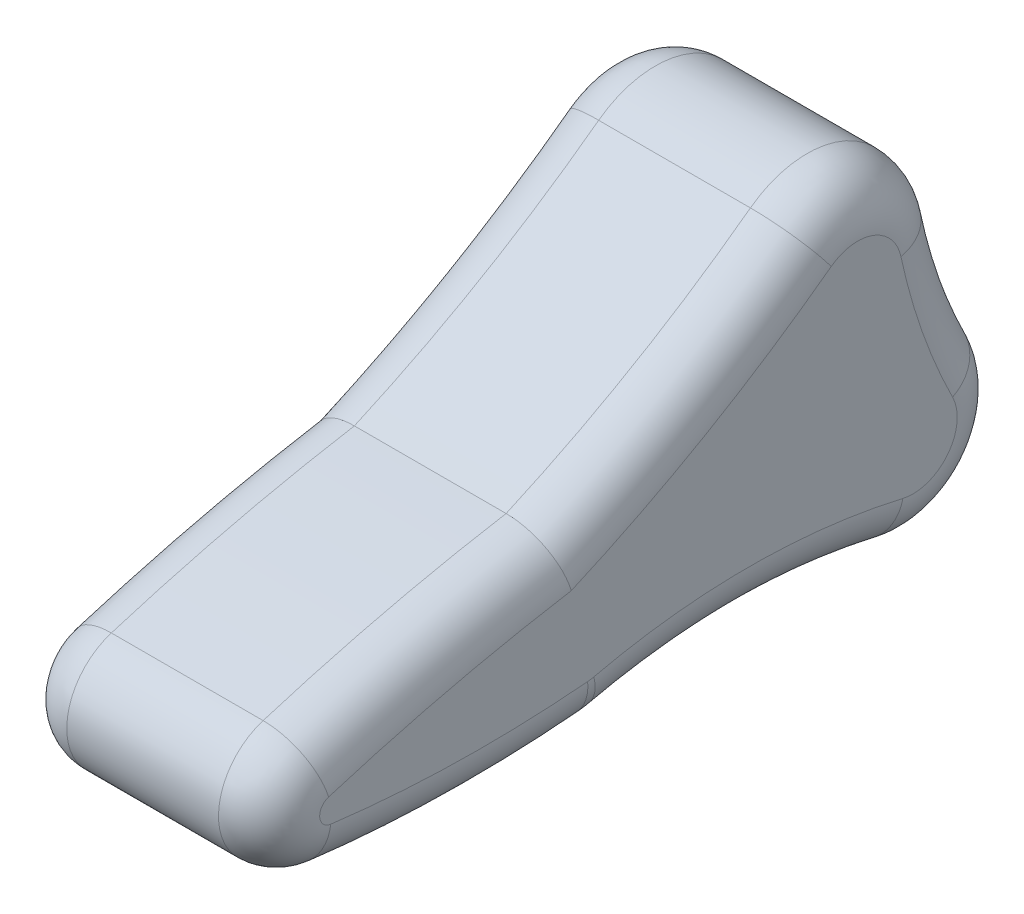
ISO-10303-21;
HEADER;
FILE_DESCRIPTION(('STEP AP214'),'2;1');
FILE_NAME('part.step','',(''),(''),'','','');
FILE_SCHEMA(('AUTOMOTIVE_DESIGN { 1 0 10303 214 1 1 1 1 }'));
ENDSEC;
DATA;
#1=APPLICATION_CONTEXT('core data for automotive mechanical design processes');
#2=APPLICATION_PROTOCOL_DEFINITION('international standard','automotive_design',2000,#1);
#3=PRODUCT_CONTEXT('',#1,'mechanical');
#4=PRODUCT('Part','Part','',(#3));
#5=PRODUCT_RELATED_PRODUCT_CATEGORY('part','',(#4));
#6=PRODUCT_DEFINITION_FORMATION('','',#4);
#7=PRODUCT_DEFINITION_CONTEXT('part definition',#1,'design');
#8=PRODUCT_DEFINITION('design','',#6,#7);
#9=PRODUCT_DEFINITION_SHAPE('','',#8);
#10=(LENGTH_UNIT() NAMED_UNIT(*) SI_UNIT(.MILLI.,.METRE.));
#11=(NAMED_UNIT(*) PLANE_ANGLE_UNIT() SI_UNIT($,.RADIAN.));
#12=(NAMED_UNIT(*) SI_UNIT($,.STERADIAN.) SOLID_ANGLE_UNIT());
#13=UNCERTAINTY_MEASURE_WITH_UNIT(LENGTH_MEASURE(1.E-05),#10,'distance_accuracy_value','');
#14=(GEOMETRIC_REPRESENTATION_CONTEXT(3) GLOBAL_UNCERTAINTY_ASSIGNED_CONTEXT((#13)) GLOBAL_UNIT_ASSIGNED_CONTEXT((#10,
#11,#12)) REPRESENTATION_CONTEXT('',''));
#15=CARTESIAN_POINT('',(0.,0.,0.));
#16=DIRECTION('',(0.,0.,1.));
#17=DIRECTION('',(1.,0.,0.));
#18=AXIS2_PLACEMENT_3D('',#15,#16,#17);
#19=CARTESIAN_POINT('',(165.1,-721.036665442336,300.274692445142));
#20=DIRECTION('',(-1.,0.,0.));
#21=DIRECTION('',(0.,0.,1.));
#22=AXIS2_PLACEMENT_3D('',#19,#20,#21);
#23=CYLINDRICAL_SURFACE('',#22,508.);
#24=DIRECTION('',(-1.,0.,0.));
#25=VECTOR('',#24,1.);
#26=CARTESIAN_POINT('',(114.3,-1185.70392378103,94.9740859482164));
#27=LINE('',#26,#25);
#28=CARTESIAN_POINT('',(144.78,-1185.70392378103,94.9740859482165));
#29=VERTEX_POINT('',#28);
#30=CARTESIAN_POINT('',(83.82,-1185.70392378103,94.9740859482163));
#31=VERTEX_POINT('',#30);
#32=EDGE_CURVE('E344',#29,#31,#27,.T.);
#33=ORIENTED_EDGE('',*,*,#32,.F.);
#34=CARTESIAN_POINT('',(144.78,-721.036665442336,300.274692445142));
#35=DIRECTION('',(-1.,0.,0.));
#36=DIRECTION('',(0.,0.,1.));
#37=AXIS2_PLACEMENT_3D('',#34,#35,#36);
#38=CIRCLE('',#37,508.);
#39=CARTESIAN_POINT('',(144.78,-1128.45838360628,-3.15823847756057));
#40=VERTEX_POINT('',#39);
#41=EDGE_CURVE('E222',#29,#40,#38,.F.);
#42=ORIENTED_EDGE('',*,*,#41,.T.);
#43=DIRECTION('',(-1.,0.,0.));
#44=VECTOR('',#43,1.);
#45=CARTESIAN_POINT('',(165.1,-1128.45838360628,-3.15823847756058));
#46=LINE('',#45,#44);
#47=CARTESIAN_POINT('',(83.8200000000001,-1128.45838360628,-3.15823847756057));
#48=VERTEX_POINT('',#47);
#49=EDGE_CURVE('E356',#40,#48,#46,.T.);
#50=ORIENTED_EDGE('',*,*,#49,.T.);
#51=CARTESIAN_POINT('',(83.82,-721.036665442336,300.274692445142));
#52=DIRECTION('',(-1.,0.,0.));
#53=DIRECTION('',(0.,0.,1.));
#54=AXIS2_PLACEMENT_3D('',#51,#52,#53);
#55=CIRCLE('',#54,508.);
#56=EDGE_CURVE('E220',#48,#31,#55,.T.);
#57=ORIENTED_EDGE('',*,*,#56,.T.);
#58=EDGE_LOOP('',(#33,#42,#50,#57));
#59=FACE_BOUND('',#58,.T.);
#60=ADVANCED_FACE('F33',(#59),#23,.F.);
#61=CARTESIAN_POINT('',(165.1,-1103.40350261757,-286.75330139272));
#62=DIRECTION('',(-1.,0.,0.));
#63=DIRECTION('',(0.,0.,1.));
#64=AXIS2_PLACEMENT_3D('',#61,#62,#63);
#65=CYLINDRICAL_SURFACE('',#64,228.6);
#66=DIRECTION('',(-1.,0.,0.));
#67=VECTOR('',#66,1.);
#68=CARTESIAN_POINT('',(165.1,-1151.07051106129,-63.1782215961857));
#69=LINE('',#68,#67);
#70=CARTESIAN_POINT('',(144.78,-1151.07051106129,-63.1782215961855));
#71=VERTEX_POINT('',#70);
#72=CARTESIAN_POINT('',(83.8200000000001,-1151.07051106129,-63.1782215961856));
#73=VERTEX_POINT('',#72);
#74=EDGE_CURVE('E177',#71,#73,#69,.T.);
#75=ORIENTED_EDGE('',*,*,#74,.F.);
#76=CARTESIAN_POINT('',(144.78,-1103.40350261757,-286.75330139272));
#77=DIRECTION('',(-1.,0.,0.));
#78=DIRECTION('',(0.,0.,1.));
#79=AXIS2_PLACEMENT_3D('',#76,#77,#78);
#80=CIRCLE('',#79,228.6);
#81=CARTESIAN_POINT('',(144.78,-1205.49908248986,-82.2185792291185));
#82=VERTEX_POINT('',#81);
#83=EDGE_CURVE('E193',#71,#82,#80,.F.);
#84=ORIENTED_EDGE('',*,*,#83,.T.);
#85=DIRECTION('',(-1.,0.,0.));
#86=VECTOR('',#85,1.);
#87=CARTESIAN_POINT('',(165.1,-1205.49908248986,-82.2185792291186));
#88=LINE('',#87,#86);
#89=CARTESIAN_POINT('',(83.8200000000001,-1205.49908248986,-82.2185792291186));
#90=VERTEX_POINT('',#89);
#91=EDGE_CURVE('E347',#82,#90,#88,.T.);
#92=ORIENTED_EDGE('',*,*,#91,.T.);
#93=CARTESIAN_POINT('',(83.82,-1103.40350261757,-286.75330139272));
#94=DIRECTION('',(-1.,0.,0.));
#95=DIRECTION('',(0.,0.,1.));
#96=AXIS2_PLACEMENT_3D('',#93,#94,#95);
#97=CIRCLE('',#96,228.6);
#98=EDGE_CURVE('E191',#90,#73,#97,.T.);
#99=ORIENTED_EDGE('',*,*,#98,.T.);
#100=EDGE_LOOP('',(#75,#84,#92,#99));
#101=FACE_BOUND('',#100,.T.);
#102=ADVANCED_FACE('F35',(#101),#65,.F.);
#103=CARTESIAN_POINT('',(165.1,-1159.01501246857,-25.9157082967632));
#104=DIRECTION('',(-1.,0.,0.));
#105=DIRECTION('',(0.,0.,1.));
#106=AXIS2_PLACEMENT_3D('',#103,#104,#105);
#107=CYLINDRICAL_SURFACE('',#106,38.1);
#108=ORIENTED_EDGE('',*,*,#49,.F.);
#109=CARTESIAN_POINT('',(144.78,-1159.01501246857,-25.9157082967631));
#110=DIRECTION('',(-1.,0.,0.));
#111=DIRECTION('',(0.,0.,1.));
#112=AXIS2_PLACEMENT_3D('',#109,#110,#111);
#113=CIRCLE('',#112,38.1);
#114=EDGE_CURVE('E163',#40,#71,#113,.T.);
#115=ORIENTED_EDGE('',*,*,#114,.T.);
#116=ORIENTED_EDGE('',*,*,#74,.T.);
#117=CARTESIAN_POINT('',(83.8200000000001,-1159.01501246857,-25.9157082967634));
#118=DIRECTION('',(-1.,0.,0.));
#119=DIRECTION('',(0.,0.,1.));
#120=AXIS2_PLACEMENT_3D('',#117,#118,#119);
#121=CIRCLE('',#120,38.1);
#122=EDGE_CURVE('E183',#73,#48,#121,.F.);
#123=ORIENTED_EDGE('',*,*,#122,.T.);
#124=EDGE_LOOP('',(#108,#115,#116,#123));
#125=FACE_BOUND('',#124,.T.);
#126=ADVANCED_FACE('F382',(#125),#107,.T.);
#127=CARTESIAN_POINT('',(165.1,-1222.51501246857,84.0695179838606));
#128=DIRECTION('',(-1.,0.,0.));
#129=DIRECTION('',(0.,0.,1.));
#130=AXIS2_PLACEMENT_3D('',#127,#128,#129);
#131=CYLINDRICAL_SURFACE('',#130,38.1000000000002);
#132=DIRECTION('',(-1.,0.,0.));
#133=VECTOR('',#132,1.);
#134=CARTESIAN_POINT('',(165.1,-1259.62669209869,75.4478455804447));
#135=LINE('',#134,#133);
#136=CARTESIAN_POINT('',(144.78,-1259.62669209869,75.4478455804447));
#137=VERTEX_POINT('',#136);
#138=CARTESIAN_POINT('',(83.8200000000001,-1259.62669209869,75.4478455804447));
#139=VERTEX_POINT('',#138);
#140=EDGE_CURVE('E353',#137,#139,#135,.T.);
#141=ORIENTED_EDGE('',*,*,#140,.F.);
#142=CARTESIAN_POINT('',(144.78,-1222.51501246857,84.0695179838609));
#143=DIRECTION('',(-1.,0.,0.));
#144=DIRECTION('',(0.,0.,1.));
#145=AXIS2_PLACEMENT_3D('',#142,#143,#144);
#146=CIRCLE('',#145,38.1000000000002);
#147=CARTESIAN_POINT('',(144.78,-1260.4716735161,80.767718152978));
#148=VERTEX_POINT('',#147);
#149=EDGE_CURVE('E205',#137,#148,#146,.T.);
#150=ORIENTED_EDGE('',*,*,#149,.T.);
#151=DIRECTION('',(-1.,0.,0.));
#152=VECTOR('',#151,1.);
#153=CARTESIAN_POINT('',(165.1,-1260.4716735161,80.767718152978));
#154=LINE('',#153,#152);
#155=CARTESIAN_POINT('',(83.82,-1260.4716735161,80.7677181529781));
#156=VERTEX_POINT('',#155);
#157=EDGE_CURVE('E335',#148,#156,#154,.T.);
#158=ORIENTED_EDGE('',*,*,#157,.T.);
#159=CARTESIAN_POINT('',(83.82,-1222.51501246857,84.0695179838606));
#160=DIRECTION('',(-1.,0.,0.));
#161=DIRECTION('',(0.,0.,1.));
#162=AXIS2_PLACEMENT_3D('',#159,#160,#161);
#163=CIRCLE('',#162,38.1000000000002);
#164=EDGE_CURVE('E203',#156,#139,#163,.F.);
#165=ORIENTED_EDGE('',*,*,#164,.T.);
#166=EDGE_LOOP('',(#141,#150,#158,#165));
#167=FACE_BOUND('',#166,.T.);
#168=ADVANCED_FACE('F427',(#167),#131,.T.);
#169=CARTESIAN_POINT('',(165.1,-1507.03788963278,17.9700295576711));
#170=DIRECTION('',(-1.,0.,0.));
#171=DIRECTION('',(0.,0.,1.));
#172=AXIS2_PLACEMENT_3D('',#169,#170,#171);
#173=CYLINDRICAL_SURFACE('',#172,254.);
#174=DIRECTION('',(-1.,0.,0.));
#175=VECTOR('',#174,1.);
#176=CARTESIAN_POINT('',(165.1,-1259.62669209869,-39.5077864651019));
#177=LINE('',#176,#175);
#178=CARTESIAN_POINT('',(144.78,-1259.62669209869,-39.507786465102));
#179=VERTEX_POINT('',#178);
#180=CARTESIAN_POINT('',(83.82,-1259.62669209869,-39.5077864651021));
#181=VERTEX_POINT('',#180);
#182=EDGE_CURVE('E350',#179,#181,#177,.T.);
#183=ORIENTED_EDGE('',*,*,#182,.F.);
#184=CARTESIAN_POINT('',(144.78,-1507.03788963278,17.9700295576712));
#185=DIRECTION('',(-1.,0.,0.));
#186=DIRECTION('',(0.,0.,1.));
#187=AXIS2_PLACEMENT_3D('',#184,#185,#186);
#188=CIRCLE('',#187,254.);
#189=EDGE_CURVE('E201',#179,#137,#188,.F.);
#190=ORIENTED_EDGE('',*,*,#189,.T.);
#191=ORIENTED_EDGE('',*,*,#140,.T.);
#192=CARTESIAN_POINT('',(83.8200000000001,-1507.03788963278,17.9700295576711));
#193=DIRECTION('',(-1.,0.,0.));
#194=DIRECTION('',(0.,0.,1.));
#195=AXIS2_PLACEMENT_3D('',#192,#193,#194);
#196=CIRCLE('',#195,254.);
#197=EDGE_CURVE('E199',#139,#181,#196,.T.);
#198=ORIENTED_EDGE('',*,*,#197,.T.);
#199=EDGE_LOOP('',(#183,#190,#191,#198));
#200=FACE_BOUND('',#199,.T.);
#201=ADVANCED_FACE('F433',(#200),#173,.F.);
#202=CARTESIAN_POINT('',(165.1,-1222.51501246857,-48.1294588685182));
#203=DIRECTION('',(-1.,0.,0.));
#204=DIRECTION('',(0.,0.,1.));
#205=AXIS2_PLACEMENT_3D('',#202,#203,#204);
#206=CYLINDRICAL_SURFACE('',#205,38.1000000000002);
#207=ORIENTED_EDGE('',*,*,#91,.F.);
#208=CARTESIAN_POINT('',(144.78,-1222.51501246857,-48.1294588685182));
#209=DIRECTION('',(-1.,0.,0.));
#210=DIRECTION('',(0.,0.,1.));
#211=AXIS2_PLACEMENT_3D('',#208,#209,#210);
#212=CIRCLE('',#211,38.1000000000002);
#213=EDGE_CURVE('E197',#82,#179,#212,.T.);
#214=ORIENTED_EDGE('',*,*,#213,.T.);
#215=ORIENTED_EDGE('',*,*,#182,.T.);
#216=CARTESIAN_POINT('',(83.8200000000001,-1222.51501246857,-48.1294588685181));
#217=DIRECTION('',(-1.,0.,0.));
#218=DIRECTION('',(0.,0.,1.));
#219=AXIS2_PLACEMENT_3D('',#216,#217,#218);
#220=CIRCLE('',#219,38.1000000000002);
#221=EDGE_CURVE('E195',#181,#90,#220,.F.);
#222=ORIENTED_EDGE('',*,*,#221,.T.);
#223=EDGE_LOOP('',(#207,#214,#215,#222));
#224=FACE_BOUND('',#223,.T.);
#225=ADVANCED_FACE('F438',(#224),#206,.T.);
#226=CARTESIAN_POINT('',(165.1,-1131.20925754307,-156.334504844742));
#227=DIRECTION('',(-1.,0.,0.));
#228=DIRECTION('',(0.,0.,1.));
#229=AXIS2_PLACEMENT_3D('',#226,#227,#228);
#230=PLANE('',#229);
#231=CARTESIAN_POINT('',(165.1,-1103.40350261757,-286.75330139272));
#232=DIRECTION('',(-1.,0.,0.));
#233=DIRECTION('',(0.,0.,1.));
#234=AXIS2_PLACEMENT_3D('',#231,#232,#233);
#235=CIRCLE('',#234,248.92);
#236=CARTESIAN_POINT('',(165.1,-1214.57424514517,-64.0377150367987));
#237=VERTEX_POINT('',#236);
#238=CARTESIAN_POINT('',(165.1,-1155.30757847851,-43.3048811698271));
#239=VERTEX_POINT('',#238);
#240=EDGE_CURVE('E181',#237,#239,#235,.T.);
#241=ORIENTED_EDGE('',*,*,#240,.T.);
#242=CARTESIAN_POINT('',(165.1,-1159.01501246857,-25.9157082967632));
#243=DIRECTION('',(-1.,0.,0.));
#244=DIRECTION('',(0.,0.,1.));
#245=AXIS2_PLACEMENT_3D('',#242,#243,#244);
#246=CIRCLE('',#245,17.78);
#247=CARTESIAN_POINT('',(165.1,-1144.75525233284,-15.2955557144687));
#248=VERTEX_POINT('',#247);
#249=EDGE_CURVE('E161',#239,#248,#246,.F.);
#250=ORIENTED_EDGE('',*,*,#249,.T.);
#251=CARTESIAN_POINT('',(165.1,-721.036665442336,300.274692445142));
#252=DIRECTION('',(-1.,0.,0.));
#253=DIRECTION('',(0.,0.,1.));
#254=AXIS2_PLACEMENT_3D('',#251,#252,#253);
#255=CIRCLE('',#254,528.32);
#256=CARTESIAN_POINT('',(165.1,-1205.32684173991,89.1229755644512));
#257=VERTEX_POINT('',#256);
#258=EDGE_CURVE('E170',#248,#257,#255,.T.);
#259=ORIENTED_EDGE('',*,*,#258,.T.);
#260=CARTESIAN_POINT('',(165.1,-1937.01800195655,-32.1917739956208));
#261=DIRECTION('',(-1.,0.,0.));
#262=DIRECTION('',(0.,0.,1.));
#263=AXIS2_PLACEMENT_3D('',#260,#261,#262);
#264=CIRCLE('',#263,741.68);
#265=CARTESIAN_POINT('',(165.1,-1228.34510342367,186.604810267022));
#266=VERTEX_POINT('',#265);
#267=EDGE_CURVE('E176',#257,#266,#264,.F.);
#268=ORIENTED_EDGE('',*,*,#267,.T.);
#269=CARTESIAN_POINT('',(165.1,-1233.19902738622,185.106203525497));
#270=DIRECTION('',(-1.,0.,0.));
#271=DIRECTION('',(0.,0.,1.));
#272=AXIS2_PLACEMENT_3D('',#269,#270,#271);
#273=CIRCLE('',#272,5.07999999999997);
#274=CARTESIAN_POINT('',(165.1,-1238.23919757398,185.741092868943));
#275=VERTEX_POINT('',#274);
#276=EDGE_CURVE('E362',#266,#275,#273,.F.);
#277=ORIENTED_EDGE('',*,*,#276,.T.);
#278=CARTESIAN_POINT('',(165.1,-754.382859549086,124.791715898082));
#279=DIRECTION('',(-1.,0.,0.));
#280=DIRECTION('',(0.,0.,1.));
#281=AXIS2_PLACEMENT_3D('',#278,#279,#280);
#282=CIRCLE('',#281,487.68);
#283=CARTESIAN_POINT('',(165.1,-1240.22812095742,82.5286780627821));
#284=VERTEX_POINT('',#283);
#285=EDGE_CURVE('E364',#275,#284,#282,.F.);
#286=ORIENTED_EDGE('',*,*,#285,.T.);
#287=CARTESIAN_POINT('',(165.1,-1222.51501246857,84.0695179838606));
#288=DIRECTION('',(-1.,0.,0.));
#289=DIRECTION('',(0.,0.,1.));
#290=AXIS2_PLACEMENT_3D('',#287,#288,#289);
#291=CIRCLE('',#290,17.7800000000002);
#292=CARTESIAN_POINT('',(165.1,-1239.83379629596,80.0460708622664));
#293=VERTEX_POINT('',#292);
#294=EDGE_CURVE('E366',#284,#293,#291,.F.);
#295=ORIENTED_EDGE('',*,*,#294,.T.);
#296=CARTESIAN_POINT('',(165.1,-1507.03788963278,17.9700295576711));
#297=DIRECTION('',(-1.,0.,0.));
#298=DIRECTION('',(0.,0.,1.));
#299=AXIS2_PLACEMENT_3D('',#296,#297,#298);
#300=CIRCLE('',#299,274.32);
#301=CARTESIAN_POINT('',(165.1,-1239.83379629596,-44.1060117469242));
#302=VERTEX_POINT('',#301);
#303=EDGE_CURVE('E368',#293,#302,#300,.T.);
#304=ORIENTED_EDGE('',*,*,#303,.T.);
#305=CARTESIAN_POINT('',(165.1,-1222.51501246857,-48.1294588685182));
#306=DIRECTION('',(-1.,0.,0.));
#307=DIRECTION('',(0.,0.,1.));
#308=AXIS2_PLACEMENT_3D('',#305,#306,#307);
#309=CIRCLE('',#308,17.7800000000002);
#310=EDGE_CURVE('E186',#302,#237,#309,.F.);
#311=ORIENTED_EDGE('',*,*,#310,.T.);
#312=EDGE_LOOP('',(#241,#250,#259,#268,#277,#286,#295,#304,#311));
#313=FACE_BOUND('',#312,.T.);
#314=ADVANCED_FACE('F179',(#313),#230,.F.);
#315=CARTESIAN_POINT('',(63.5000000000001,-1131.20925754307,-156.334504844742));
#316=DIRECTION('',(-1.,0.,0.));
#317=DIRECTION('',(0.,0.,1.));
#318=AXIS2_PLACEMENT_3D('',#315,#316,#317);
#319=PLANE('',#318);
#320=CARTESIAN_POINT('',(63.5,-754.382859549086,124.791715898082));
#321=DIRECTION('',(-1.,0.,0.));
#322=DIRECTION('',(0.,0.,1.));
#323=AXIS2_PLACEMENT_3D('',#320,#321,#322);
#324=CIRCLE('',#323,487.68);
#325=CARTESIAN_POINT('',(63.5000000000001,-1240.22812095742,82.5286780627823));
#326=VERTEX_POINT('',#325);
#327=CARTESIAN_POINT('',(63.5000000000001,-1238.23919757398,185.741092868943));
#328=VERTEX_POINT('',#327);
#329=EDGE_CURVE('E41',#326,#328,#324,.T.);
#330=ORIENTED_EDGE('',*,*,#329,.T.);
#331=CARTESIAN_POINT('',(63.5000000000001,-1233.19902738622,185.106203525497));
#332=DIRECTION('',(-1.,0.,0.));
#333=DIRECTION('',(0.,0.,1.));
#334=AXIS2_PLACEMENT_3D('',#331,#332,#333);
#335=CIRCLE('',#334,5.07999999999997);
#336=CARTESIAN_POINT('',(63.5000000000001,-1228.34510342367,186.604810267021));
#337=VERTEX_POINT('',#336);
#338=EDGE_CURVE('E11',#328,#337,#335,.T.);
#339=ORIENTED_EDGE('',*,*,#338,.T.);
#340=CARTESIAN_POINT('',(63.5000000000001,-1937.01800195655,-32.1917739956208));
#341=DIRECTION('',(-1.,0.,0.));
#342=DIRECTION('',(0.,0.,1.));
#343=AXIS2_PLACEMENT_3D('',#340,#341,#342);
#344=CIRCLE('',#343,741.68);
#345=CARTESIAN_POINT('',(63.5,-1205.32684173991,89.1229755644511));
#346=VERTEX_POINT('',#345);
#347=EDGE_CURVE('E224',#337,#346,#344,.T.);
#348=ORIENTED_EDGE('',*,*,#347,.T.);
#349=CARTESIAN_POINT('',(63.5,-721.036665442336,300.274692445142));
#350=DIRECTION('',(-1.,0.,0.));
#351=DIRECTION('',(0.,0.,1.));
#352=AXIS2_PLACEMENT_3D('',#349,#350,#351);
#353=CIRCLE('',#352,528.32);
#354=CARTESIAN_POINT('',(63.5000000000001,-1144.75525233284,-15.2955557144687));
#355=VERTEX_POINT('',#354);
#356=EDGE_CURVE('E226',#346,#355,#353,.F.);
#357=ORIENTED_EDGE('',*,*,#356,.T.);
#358=CARTESIAN_POINT('',(63.5000000000001,-1159.01501246857,-25.9157082967634));
#359=DIRECTION('',(-1.,0.,0.));
#360=DIRECTION('',(0.,0.,1.));
#361=AXIS2_PLACEMENT_3D('',#358,#359,#360);
#362=CIRCLE('',#361,17.78);
#363=CARTESIAN_POINT('',(63.5000000000001,-1155.30757847851,-43.3048811698271));
#364=VERTEX_POINT('',#363);
#365=EDGE_CURVE('E228',#355,#364,#362,.T.);
#366=ORIENTED_EDGE('',*,*,#365,.T.);
#367=CARTESIAN_POINT('',(63.5,-1103.40350261757,-286.75330139272));
#368=DIRECTION('',(-1.,0.,0.));
#369=DIRECTION('',(0.,0.,1.));
#370=AXIS2_PLACEMENT_3D('',#367,#368,#369);
#371=CIRCLE('',#370,248.92);
#372=CARTESIAN_POINT('',(63.5000000000001,-1214.57424514517,-64.0377150367986));
#373=VERTEX_POINT('',#372);
#374=EDGE_CURVE('E230',#364,#373,#371,.F.);
#375=ORIENTED_EDGE('',*,*,#374,.T.);
#376=CARTESIAN_POINT('',(63.5000000000001,-1222.51501246857,-48.1294588685181));
#377=DIRECTION('',(-1.,0.,0.));
#378=DIRECTION('',(0.,0.,1.));
#379=AXIS2_PLACEMENT_3D('',#376,#377,#378);
#380=CIRCLE('',#379,17.7800000000002);
#381=CARTESIAN_POINT('',(63.5000000000001,-1239.83379629596,-44.106011746924));
#382=VERTEX_POINT('',#381);
#383=EDGE_CURVE('E232',#373,#382,#380,.T.);
#384=ORIENTED_EDGE('',*,*,#383,.T.);
#385=CARTESIAN_POINT('',(63.5000000000001,-1507.03788963278,17.9700295576711));
#386=DIRECTION('',(-1.,0.,0.));
#387=DIRECTION('',(0.,0.,1.));
#388=AXIS2_PLACEMENT_3D('',#385,#386,#387);
#389=CIRCLE('',#388,274.32);
#390=CARTESIAN_POINT('',(63.5000000000001,-1239.83379629596,80.0460708622665));
#391=VERTEX_POINT('',#390);
#392=EDGE_CURVE('E234',#382,#391,#389,.F.);
#393=ORIENTED_EDGE('',*,*,#392,.T.);
#394=CARTESIAN_POINT('',(63.5,-1222.51501246857,84.0695179838606));
#395=DIRECTION('',(-1.,0.,0.));
#396=DIRECTION('',(0.,0.,1.));
#397=AXIS2_PLACEMENT_3D('',#394,#395,#396);
#398=CIRCLE('',#397,17.7800000000002);
#399=EDGE_CURVE('E51',#391,#326,#398,.T.);
#400=ORIENTED_EDGE('',*,*,#399,.T.);
#401=EDGE_LOOP('',(#330,#339,#348,#357,#366,#375,#384,#393,#400));
#402=FACE_BOUND('',#401,.T.);
#403=ADVANCED_FACE('F238',(#402),#319,.T.);
#404=CARTESIAN_POINT('',(165.1,-1937.01800195655,-32.1917739956208));
#405=DIRECTION('',(-1.,0.,0.));
#406=DIRECTION('',(0.,0.,1.));
#407=AXIS2_PLACEMENT_3D('',#404,#405,#406);
#408=CYLINDRICAL_SURFACE('',#407,762.);
#409=DIRECTION('',(-1.,0.,0.));
#410=VECTOR('',#409,1.);
#411=CARTESIAN_POINT('',(165.1,-1208.92940757345,192.599237233121));
#412=LINE('',#411,#410);
#413=CARTESIAN_POINT('',(144.78,-1208.92940757345,192.599237233121));
#414=VERTEX_POINT('',#413);
#415=CARTESIAN_POINT('',(83.82,-1208.92940757345,192.599237233121));
#416=VERTEX_POINT('',#415);
#417=EDGE_CURVE('E341',#414,#416,#412,.T.);
#418=ORIENTED_EDGE('',*,*,#417,.F.);
#419=CARTESIAN_POINT('',(144.78,-1937.01800195655,-32.1917739956207));
#420=DIRECTION('',(-1.,0.,0.));
#421=DIRECTION('',(0.,0.,1.));
#422=AXIS2_PLACEMENT_3D('',#419,#420,#421);
#423=CIRCLE('',#422,762.);
#424=EDGE_CURVE('E218',#414,#29,#423,.T.);
#425=ORIENTED_EDGE('',*,*,#424,.T.);
#426=ORIENTED_EDGE('',*,*,#32,.T.);
#427=CARTESIAN_POINT('',(83.8200000000001,-1937.01800195655,-32.1917739956208));
#428=DIRECTION('',(-1.,0.,0.));
#429=DIRECTION('',(0.,0.,1.));
#430=AXIS2_PLACEMENT_3D('',#427,#428,#429);
#431=CIRCLE('',#430,762.);
#432=EDGE_CURVE('E216',#31,#416,#431,.F.);
#433=ORIENTED_EDGE('',*,*,#432,.T.);
#434=EDGE_LOOP('',(#418,#425,#426,#433));
#435=FACE_BOUND('',#434,.T.);
#436=ADVANCED_FACE('F408',(#435),#408,.T.);
#437=CARTESIAN_POINT('',(165.1,-1233.19902738622,185.106203525497));
#438=DIRECTION('',(-1.,0.,0.));
#439=DIRECTION('',(0.,0.,1.));
#440=AXIS2_PLACEMENT_3D('',#437,#438,#439);
#441=CYLINDRICAL_SURFACE('',#440,25.4);
#442=DIRECTION('',(-1.,0.,0.));
#443=VECTOR('',#442,1.);
#444=CARTESIAN_POINT('',(165.1,-1258.39987832502,188.280650242729));
#445=LINE('',#444,#443);
#446=CARTESIAN_POINT('',(144.78,-1258.39987832502,188.280650242729));
#447=VERTEX_POINT('',#446);
#448=CARTESIAN_POINT('',(83.8200000000001,-1258.39987832502,188.280650242729));
#449=VERTEX_POINT('',#448);
#450=EDGE_CURVE('E338',#447,#449,#445,.T.);
#451=ORIENTED_EDGE('',*,*,#450,.F.);
#452=CARTESIAN_POINT('',(144.78,-1233.19902738622,185.106203525497));
#453=DIRECTION('',(-1.,0.,0.));
#454=DIRECTION('',(0.,0.,1.));
#455=AXIS2_PLACEMENT_3D('',#452,#453,#454);
#456=CIRCLE('',#455,25.4);
#457=EDGE_CURVE('E214',#447,#414,#456,.T.);
#458=ORIENTED_EDGE('',*,*,#457,.T.);
#459=ORIENTED_EDGE('',*,*,#417,.T.);
#460=CARTESIAN_POINT('',(83.8200000000001,-1233.19902738622,185.106203525497));
#461=DIRECTION('',(-1.,0.,0.));
#462=DIRECTION('',(0.,0.,1.));
#463=AXIS2_PLACEMENT_3D('',#460,#461,#462);
#464=CIRCLE('',#463,25.4);
#465=EDGE_CURVE('E211',#416,#449,#464,.F.);
#466=ORIENTED_EDGE('',*,*,#465,.T.);
#467=EDGE_LOOP('',(#451,#458,#459,#466));
#468=FACE_BOUND('',#467,.T.);
#469=ADVANCED_FACE('F413',(#468),#441,.T.);
#470=CARTESIAN_POINT('',(165.1,-754.382859549086,124.791715898082));
#471=DIRECTION('',(-1.,0.,0.));
#472=DIRECTION('',(0.,0.,1.));
#473=AXIS2_PLACEMENT_3D('',#470,#471,#472);
#474=CYLINDRICAL_SURFACE('',#473,508.);
#475=ORIENTED_EDGE('',*,*,#157,.F.);
#476=CARTESIAN_POINT('',(144.78,-754.382859549086,124.791715898082));
#477=DIRECTION('',(-1.,0.,0.));
#478=DIRECTION('',(0.,0.,1.));
#479=AXIS2_PLACEMENT_3D('',#476,#477,#478);
#480=CIRCLE('',#479,508.);
#481=EDGE_CURVE('E209',#148,#447,#480,.T.);
#482=ORIENTED_EDGE('',*,*,#481,.T.);
#483=ORIENTED_EDGE('',*,*,#450,.T.);
#484=CARTESIAN_POINT('',(83.82,-754.382859549086,124.791715898082));
#485=DIRECTION('',(-1.,0.,0.));
#486=DIRECTION('',(0.,0.,1.));
#487=AXIS2_PLACEMENT_3D('',#484,#485,#486);
#488=CIRCLE('',#487,508.);
#489=EDGE_CURVE('E207',#449,#156,#488,.F.);
#490=ORIENTED_EDGE('',*,*,#489,.T.);
#491=EDGE_LOOP('',(#475,#482,#483,#490));
#492=FACE_BOUND('',#491,.T.);
#493=ADVANCED_FACE('F467',(#492),#474,.T.);
#494=CARTESIAN_POINT('',(144.78,-1222.51501246857,84.0695179838609));
#495=DIRECTION('',(-1.,0.,0.));
#496=DIRECTION('',(0.,0.,1.));
#497=AXIS2_PLACEMENT_3D('',#494,#495,#496);
#498=DEGENERATE_TOROIDAL_SURFACE('',#497,17.7800000000002,20.32,.T.);
#499=CARTESIAN_POINT('',(144.78,-1239.83379629596,80.0460708622667));
#500=DIRECTION('',(0.,0.226290614262887,-0.974059832811376));
#501=DIRECTION('',(0.,0.974059832811376,0.226290614262887));
#502=AXIS2_PLACEMENT_3D('',#499,#500,#501);
#503=CIRCLE('',#502,20.32);
#504=EDGE_CURVE('E329',#293,#137,#503,.T.);
#505=ORIENTED_EDGE('',*,*,#504,.F.);
#506=ORIENTED_EDGE('',*,*,#294,.F.);
#507=CARTESIAN_POINT('',(144.78,-1240.22812095742,82.5286780627823));
#508=DIRECTION('',(0.,-0.0866614128840558,0.996237822769714));
#509=DIRECTION('',(0.,-0.996237822769714,-0.0866614128840558));
#510=AXIS2_PLACEMENT_3D('',#507,#508,#509);
#511=CIRCLE('',#510,20.32);
#512=EDGE_CURVE('E332',#148,#284,#511,.T.);
#513=ORIENTED_EDGE('',*,*,#512,.F.);
#514=ORIENTED_EDGE('',*,*,#149,.F.);
#515=EDGE_LOOP('',(#505,#506,#513,#514));
#516=FACE_BOUND('',#515,.T.);
#517=ADVANCED_FACE('F446',(#516),#498,.T.);
#518=CARTESIAN_POINT('',(144.78,-754.382859549086,124.791715898082));
#519=DIRECTION('',(-1.,0.,0.));
#520=DIRECTION('',(0.,0.,1.));
#521=AXIS2_PLACEMENT_3D('',#518,#519,#520);
#522=TOROIDAL_SURFACE('',#521,487.68,20.32);
#523=ORIENTED_EDGE('',*,*,#512,.T.);
#524=ORIENTED_EDGE('',*,*,#285,.F.);
#525=CARTESIAN_POINT('',(144.78,-1238.23919757398,185.741092868943));
#526=DIRECTION('',(0.,0.12497821721387,0.992159485779399));
#527=DIRECTION('',(0.,-0.992159485779399,0.12497821721387));
#528=AXIS2_PLACEMENT_3D('',#525,#526,#527);
#529=CIRCLE('',#528,20.32);
#530=EDGE_CURVE('E326',#447,#275,#529,.T.);
#531=ORIENTED_EDGE('',*,*,#530,.F.);
#532=ORIENTED_EDGE('',*,*,#481,.F.);
#533=EDGE_LOOP('',(#523,#524,#531,#532));
#534=FACE_BOUND('',#533,.T.);
#535=ADVANCED_FACE('F473',(#534),#522,.T.);
#536=CARTESIAN_POINT('',(144.78,-1507.03788963278,17.9700295576712));
#537=DIRECTION('',(-1.,0.,0.));
#538=DIRECTION('',(0.,0.,1.));
#539=AXIS2_PLACEMENT_3D('',#536,#537,#538);
#540=TOROIDAL_SURFACE('',#539,274.32,20.32);
#541=ORIENTED_EDGE('',*,*,#504,.T.);
#542=ORIENTED_EDGE('',*,*,#189,.F.);
#543=CARTESIAN_POINT('',(144.78,-1239.83379629596,-44.1060117469241));
#544=DIRECTION('',(0.,-0.22629061426289,-0.974059832811375));
#545=DIRECTION('',(0.,0.974059832811375,-0.22629061426289));
#546=AXIS2_PLACEMENT_3D('',#543,#544,#545);
#547=CIRCLE('',#546,20.32);
#548=EDGE_CURVE('E323',#302,#179,#547,.T.);
#549=ORIENTED_EDGE('',*,*,#548,.F.);
#550=ORIENTED_EDGE('',*,*,#303,.F.);
#551=EDGE_LOOP('',(#541,#542,#549,#550));
#552=FACE_BOUND('',#551,.T.);
#553=ADVANCED_FACE('F451',(#552),#540,.T.);
#554=CARTESIAN_POINT('',(144.78,-1233.19902738622,185.106203525497));
#555=DIRECTION('',(-1.,0.,0.));
#556=DIRECTION('',(0.,0.,1.));
#557=AXIS2_PLACEMENT_3D('',#554,#555,#556);
#558=DEGENERATE_TOROIDAL_SURFACE('',#557,5.07999999999997,20.32,.T.);
#559=ORIENTED_EDGE('',*,*,#530,.T.);
#560=ORIENTED_EDGE('',*,*,#276,.F.);
#561=CARTESIAN_POINT('',(144.78,-1228.34510342367,186.604810267022));
#562=DIRECTION('',(0.,0.295001327071836,-0.955496843022443));
#563=DIRECTION('',(0.,0.955496843022443,0.295001327071836));
#564=AXIS2_PLACEMENT_3D('',#561,#562,#563);
#565=CIRCLE('',#564,20.32);
#566=EDGE_CURVE('E320',#414,#266,#565,.T.);
#567=ORIENTED_EDGE('',*,*,#566,.F.);
#568=ORIENTED_EDGE('',*,*,#457,.F.);
#569=EDGE_LOOP('',(#559,#560,#567,#568));
#570=FACE_BOUND('',#569,.T.);
#571=ADVANCED_FACE('F417',(#570),#558,.T.);
#572=CARTESIAN_POINT('',(144.78,-1222.51501246857,-48.1294588685182));
#573=DIRECTION('',(-1.,0.,0.));
#574=DIRECTION('',(0.,0.,1.));
#575=AXIS2_PLACEMENT_3D('',#572,#573,#574);
#576=DEGENERATE_TOROIDAL_SURFACE('',#575,17.7800000000002,20.32,.T.);
#577=ORIENTED_EDGE('',*,*,#548,.T.);
#578=ORIENTED_EDGE('',*,*,#213,.F.);
#579=CARTESIAN_POINT('',(144.78,-1214.57424514517,-64.0377150367984));
#580=DIRECTION('',(0.,0.894727568519693,0.446612335399324));
#581=DIRECTION('',(0.,-0.446612335399324,0.894727568519693));
#582=AXIS2_PLACEMENT_3D('',#579,#580,#581);
#583=CIRCLE('',#582,20.32);
#584=EDGE_CURVE('E317',#237,#82,#583,.T.);
#585=ORIENTED_EDGE('',*,*,#584,.F.);
#586=ORIENTED_EDGE('',*,*,#310,.F.);
#587=EDGE_LOOP('',(#577,#578,#585,#586));
#588=FACE_BOUND('',#587,.T.);
#589=ADVANCED_FACE('F306',(#588),#576,.T.);
#590=CARTESIAN_POINT('',(144.78,-1937.01800195655,-32.1917739956207));
#591=DIRECTION('',(-1.,0.,0.));
#592=DIRECTION('',(0.,0.,1.));
#593=AXIS2_PLACEMENT_3D('',#590,#591,#592);
#594=TOROIDAL_SURFACE('',#593,741.68,20.32);
#595=ORIENTED_EDGE('',*,*,#566,.T.);
#596=ORIENTED_EDGE('',*,*,#267,.F.);
#597=CARTESIAN_POINT('',(144.78,-1185.70392378103,94.9740859482165));
#598=CARTESIAN_POINT('',(145.064178495272,-1185.70392333155,94.9740861196637));
#599=CARTESIAN_POINT('',(145.348325221734,-1185.70967812543,94.9723571677874));
#600=CARTESIAN_POINT('',(145.916104054586,-1185.73268049432,94.9654466522544));
#601=CARTESIAN_POINT('',(146.199736173448,-1185.74992778695,94.960265173431));
#602=CARTESIAN_POINT('',(147.049049577823,-1185.81886966539,94.9395540605911));
#603=CARTESIAN_POINT('',(147.613304366721,-1185.88776427255,94.9188577436418));
#604=CARTESIAN_POINT('',(148.733214484422,-1186.07084842118,94.8638655025591));
#605=CARTESIAN_POINT('',(149.288877175227,-1186.18499666471,94.8295819779645));
#606=CARTESIAN_POINT('',(150.113202417024,-1186.38949059487,94.7681751610867));
#607=CARTESIAN_POINT('',(150.386460901435,-1186.46320437858,94.7460414690979));
#608=CARTESIAN_POINT('',(150.929562505796,-1186.62161162233,94.6984819405847));
#609=CARTESIAN_POINT('',(151.199404740389,-1186.70630786713,94.673055269076));
#610=CARTESIAN_POINT('',(152.003096217459,-1186.97666337554,94.5919007082385));
#611=CARTESIAN_POINT('',(152.53108373245,-1187.17858283491,94.5313002483159));
#612=CARTESIAN_POINT('',(153.567456448482,-1187.62424973946,94.3975835175735));
#613=CARTESIAN_POINT('',(154.075841560237,-1187.86799737514,94.3244671897541));
#614=CARTESIAN_POINT('',(154.820937989953,-1188.26356618952,94.2058484152667));
#615=CARTESIAN_POINT('',(155.066410899871,-1188.40042714004,94.1648140781953));
#616=CARTESIAN_POINT('',(155.551082094473,-1188.68386114675,94.0798478543907));
#617=CARTESIAN_POINT('',(155.790281973171,-1188.83043170163,94.0359167139227));
#618=CARTESIAN_POINT('',(156.497976534402,-1189.284401377,93.899874276368));
#619=CARTESIAN_POINT('',(156.956613161818,-1189.60608348215,93.8035064731481));
#620=CARTESIAN_POINT('',(157.845630166114,-1190.28619443948,93.5998465654577));
#621=CARTESIAN_POINT('',(158.275910237969,-1190.64474333452,93.4925187822379));
#622=CARTESIAN_POINT('',(159.103617894477,-1191.3951295096,93.2680003042721));
#623=CARTESIAN_POINT('',(159.501045246087,-1191.78696702573,93.1508095395743));
#624=CARTESIAN_POINT('',(160.260469973647,-1192.60130988627,92.9073746224119));
#625=CARTESIAN_POINT('',(160.622456563649,-1193.02382449914,92.7811277339601));
#626=CARTESIAN_POINT('',(161.136786511186,-1193.6780817921,92.5857377971644));
#627=CARTESIAN_POINT('',(161.303460889443,-1193.89959099176,92.5196018040442));
#628=CARTESIAN_POINT('',(161.62706454036,-1194.34914543439,92.3854135649493));
#629=CARTESIAN_POINT('',(161.783991332845,-1194.5771923194,92.3173608376304));
#630=CARTESIAN_POINT('',(162.241889468021,-1195.27383217592,92.109528791878));
#631=CARTESIAN_POINT('',(162.527525592297,-1195.7518047903,91.9670073340605));
#632=CARTESIAN_POINT('',(163.055984984574,-1196.72905455377,91.6757795494084));
#633=CARTESIAN_POINT('',(163.298808173809,-1197.22833174206,91.5270732111957));
#634=CARTESIAN_POINT('',(163.629639847376,-1197.99036867748,91.3002406828749));
#635=CARTESIAN_POINT('',(163.734343595196,-1198.24654906479,91.2240065881032));
#636=CARTESIAN_POINT('',(163.932458340293,-1198.76282748216,91.0704184968764));
#637=CARTESIAN_POINT('',(164.025872006391,-1199.02292456994,90.9930647699473));
#638=CARTESIAN_POINT('',(164.28893930676,-1199.80844017663,90.7595207702698));
#639=CARTESIAN_POINT('',(164.44149988465,-1200.33926887108,90.6017923597791));
#640=CARTESIAN_POINT('',(164.657537769958,-1201.23556542778,90.335635922839));
#641=CARTESIAN_POINT('',(164.733826979321,-1201.59825773772,90.2279783504456));
#642=CARTESIAN_POINT('',(164.865064358834,-1202.32720820759,90.0116957692961));
#643=CARTESIAN_POINT('',(164.920014017817,-1202.69346611693,89.9030708285731));
#644=CARTESIAN_POINT('',(165.008329879396,-1203.42777955179,89.6853800097318));
#645=CARTESIAN_POINT('',(165.041730340459,-1203.79583128214,89.5763151102474));
#646=CARTESIAN_POINT('',(165.08698374201,-1204.53311338305,89.3579286819132));
#647=CARTESIAN_POINT('',(165.098842846972,-1204.90234338612,89.248607235449));
#648=CARTESIAN_POINT('',(165.099973144214,-1205.28997256752,89.1338867997374));
#649=CARTESIAN_POINT('',(165.10000001502,-1205.30840724024,89.1284310987257));
#650=CARTESIAN_POINT('',(165.1,-1205.32684173991,89.1229755644514));
#651=B_SPLINE_CURVE_WITH_KNOTS('',3,(#597,#598,#599,#600,#601,#602,#603,#604,#605,#606,#607,
#608,#609,#610,#611,#612,#613,#614,#615,#616,#617,#618,#619,#620,#621,#622,#623,#624,#625,#626,
#627,#628,#629,#630,#631,#632,#633,#634,#635,#636,#637,#638,#639,#640,#641,#642,#643,#644,#645,
#646,#647,#648,#649,#650),.UNSPECIFIED.,.F.,.F.,(4,2,2,2,2,2,2,2,2,2,2,2,2,2,2,2,2,2,2,2,2,2,2,
2,2,2,4),(0.,0.85240856803782,1.70479619202685,3.40910360482115,5.11185925336028,
5.96331019946016,6.81497746796469,8.51839386774687,10.2218180254094,11.0736810590654,
11.9253254894571,13.6284535691484,15.3373142775468,17.0461871068102,18.7555784036958,
19.6103419657909,20.4653221306134,22.1874724593131,23.9096259563245,24.7705796137678,
25.6313293538357,27.3522007785312,28.5095195665804,29.6667575954914,30.8221513082639,
31.9772143307882,32.0348893933151),.UNSPECIFIED.);
#652=EDGE_CURVE('E173',#29,#257,#651,.T.);
#653=ORIENTED_EDGE('',*,*,#652,.F.);
#654=ORIENTED_EDGE('',*,*,#424,.F.);
#655=EDGE_LOOP('',(#595,#596,#653,#654));
#656=FACE_BOUND('',#655,.T.);
#657=ADVANCED_FACE('F301',(#656),#594,.T.);
#658=CARTESIAN_POINT('',(144.78,-1103.40350261757,-286.75330139272));
#659=DIRECTION('',(-1.,0.,0.));
#660=DIRECTION('',(0.,0.,1.));
#661=AXIS2_PLACEMENT_3D('',#658,#659,#660);
#662=TOROIDAL_SURFACE('',#661,248.92,20.32);
#663=ORIENTED_EDGE('',*,*,#584,.T.);
#664=ORIENTED_EDGE('',*,*,#83,.F.);
#665=CARTESIAN_POINT('',(144.78,-1155.30757847851,-43.3048811698269));
#666=DIRECTION('',(0.,0.978018721769617,0.208517097304094));
#667=DIRECTION('',(0.,-0.208517097304094,0.978018721769617));
#668=AXIS2_PLACEMENT_3D('',#665,#666,#667);
#669=CIRCLE('',#668,20.32);
#670=EDGE_CURVE('E166',#239,#71,#669,.T.);
#671=ORIENTED_EDGE('',*,*,#670,.F.);
#672=ORIENTED_EDGE('',*,*,#240,.F.);
#673=EDGE_LOOP('',(#663,#664,#671,#672));
#674=FACE_BOUND('',#673,.T.);
#675=ADVANCED_FACE('F305',(#674),#662,.T.);
#676=CARTESIAN_POINT('',(144.78,-721.036665442336,300.274692445142));
#677=DIRECTION('',(-1.,0.,0.));
#678=DIRECTION('',(0.,0.,1.));
#679=AXIS2_PLACEMENT_3D('',#676,#677,#678);
#680=TOROIDAL_SURFACE('',#679,528.32,20.32);
#681=ORIENTED_EDGE('',*,*,#652,.T.);
#682=ORIENTED_EDGE('',*,*,#258,.F.);
#683=CARTESIAN_POINT('',(144.78,-1144.75525233284,-15.2955557144685));
#684=DIRECTION('',(0.,0.597308919139178,-0.802011256228232));
#685=DIRECTION('',(0.,0.802011256228232,0.597308919139178));
#686=AXIS2_PLACEMENT_3D('',#683,#684,#685);
#687=CIRCLE('',#686,20.32);
#688=EDGE_CURVE('E157',#40,#248,#687,.T.);
#689=ORIENTED_EDGE('',*,*,#688,.F.);
#690=ORIENTED_EDGE('',*,*,#41,.F.);
#691=EDGE_LOOP('',(#681,#682,#689,#690));
#692=FACE_BOUND('',#691,.T.);
#693=ADVANCED_FACE('F171',(#692),#680,.T.);
#694=CARTESIAN_POINT('',(144.78,-1159.01501246857,-25.9157082967631));
#695=DIRECTION('',(-1.,0.,0.));
#696=DIRECTION('',(0.,0.,1.));
#697=AXIS2_PLACEMENT_3D('',#694,#695,#696);
#698=DEGENERATE_TOROIDAL_SURFACE('',#697,17.78,20.32,.T.);
#699=ORIENTED_EDGE('',*,*,#670,.T.);
#700=ORIENTED_EDGE('',*,*,#114,.F.);
#701=ORIENTED_EDGE('',*,*,#688,.T.);
#702=ORIENTED_EDGE('',*,*,#249,.F.);
#703=EDGE_LOOP('',(#699,#700,#701,#702));
#704=FACE_BOUND('',#703,.T.);
#705=ADVANCED_FACE('F159',(#704),#698,.T.);
#706=CARTESIAN_POINT('',(83.82,-1103.40350261757,-286.75330139272));
#707=DIRECTION('',(-1.,0.,0.));
#708=DIRECTION('',(0.,0.,1.));
#709=AXIS2_PLACEMENT_3D('',#706,#707,#708);
#710=TOROIDAL_SURFACE('',#709,248.92,20.32);
#711=CARTESIAN_POINT('',(83.8200000000001,-1155.30757847851,-43.3048811698271));
#712=DIRECTION('',(0.,0.978018721769617,0.208517097304094));
#713=DIRECTION('',(0.,-0.208517097304094,0.978018721769617));
#714=AXIS2_PLACEMENT_3D('',#711,#712,#713);
#715=CIRCLE('',#714,20.32);
#716=EDGE_CURVE('E389',#73,#364,#715,.T.);
#717=ORIENTED_EDGE('',*,*,#716,.F.);
#718=ORIENTED_EDGE('',*,*,#98,.F.);
#719=CARTESIAN_POINT('',(83.8200000000001,-1214.57424514517,-64.0377150367986));
#720=DIRECTION('',(0.,-0.894727568519693,-0.446612335399324));
#721=DIRECTION('',(0.,0.446612335399324,-0.894727568519693));
#722=AXIS2_PLACEMENT_3D('',#719,#720,#721);
#723=CIRCLE('',#722,20.32);
#724=EDGE_CURVE('E167',#373,#90,#723,.T.);
#725=ORIENTED_EDGE('',*,*,#724,.F.);
#726=ORIENTED_EDGE('',*,*,#374,.F.);
#727=EDGE_LOOP('',(#717,#718,#725,#726));
#728=FACE_BOUND('',#727,.T.);
#729=ADVANCED_FACE('F294',(#728),#710,.T.);
#730=CARTESIAN_POINT('',(83.8200000000001,-1222.51501246857,-48.1294588685181));
#731=DIRECTION('',(-1.,0.,0.));
#732=DIRECTION('',(0.,0.,1.));
#733=AXIS2_PLACEMENT_3D('',#730,#731,#732);
#734=DEGENERATE_TOROIDAL_SURFACE('',#733,17.7800000000002,20.32,.T.);
#735=ORIENTED_EDGE('',*,*,#724,.T.);
#736=ORIENTED_EDGE('',*,*,#221,.F.);
#737=CARTESIAN_POINT('',(83.8200000000001,-1239.83379629596,-44.106011746924));
#738=DIRECTION('',(0.,0.226290614262888,0.974059832811375));
#739=DIRECTION('',(0.,-0.974059832811375,0.226290614262888));
#740=AXIS2_PLACEMENT_3D('',#737,#738,#739);
#741=CIRCLE('',#740,20.32);
#742=EDGE_CURVE('E393',#382,#181,#741,.T.);
#743=ORIENTED_EDGE('',*,*,#742,.F.);
#744=ORIENTED_EDGE('',*,*,#383,.F.);
#745=EDGE_LOOP('',(#735,#736,#743,#744));
#746=FACE_BOUND('',#745,.T.);
#747=ADVANCED_FACE('F290',(#746),#734,.T.);
#748=CARTESIAN_POINT('',(83.8200000000001,-1159.01501246857,-25.9157082967634));
#749=DIRECTION('',(-1.,0.,0.));
#750=DIRECTION('',(0.,0.,1.));
#751=AXIS2_PLACEMENT_3D('',#748,#749,#750);
#752=DEGENERATE_TOROIDAL_SURFACE('',#751,17.78,20.32,.T.);
#753=ORIENTED_EDGE('',*,*,#716,.T.);
#754=ORIENTED_EDGE('',*,*,#365,.F.);
#755=CARTESIAN_POINT('',(83.8200000000001,-1144.75525233284,-15.2955557144687));
#756=DIRECTION('',(0.,-0.597308919139179,0.802011256228231));
#757=DIRECTION('',(0.,-0.802011256228231,-0.597308919139179));
#758=AXIS2_PLACEMENT_3D('',#755,#756,#757);
#759=CIRCLE('',#758,20.32);
#760=EDGE_CURVE('E249',#48,#355,#759,.T.);
#761=ORIENTED_EDGE('',*,*,#760,.F.);
#762=ORIENTED_EDGE('',*,*,#122,.F.);
#763=EDGE_LOOP('',(#753,#754,#761,#762));
#764=FACE_BOUND('',#763,.T.);
#765=ADVANCED_FACE('F287',(#764),#752,.T.);
#766=CARTESIAN_POINT('',(83.8200000000001,-1507.03788963278,17.9700295576711));
#767=DIRECTION('',(-1.,0.,0.));
#768=DIRECTION('',(0.,0.,1.));
#769=AXIS2_PLACEMENT_3D('',#766,#767,#768);
#770=TOROIDAL_SURFACE('',#769,274.32,20.32);
#771=ORIENTED_EDGE('',*,*,#742,.T.);
#772=ORIENTED_EDGE('',*,*,#197,.F.);
#773=CARTESIAN_POINT('',(83.8200000000001,-1239.83379629596,80.0460708622665));
#774=DIRECTION('',(0.,-0.226290614262886,0.974059832811376));
#775=DIRECTION('',(0.,-0.974059832811376,-0.226290614262886));
#776=AXIS2_PLACEMENT_3D('',#773,#774,#775);
#777=CIRCLE('',#776,20.32);
#778=EDGE_CURVE('E245',#391,#139,#777,.T.);
#779=ORIENTED_EDGE('',*,*,#778,.F.);
#780=ORIENTED_EDGE('',*,*,#392,.F.);
#781=EDGE_LOOP('',(#771,#772,#779,#780));
#782=FACE_BOUND('',#781,.T.);
#783=ADVANCED_FACE('F246',(#782),#770,.T.);
#784=CARTESIAN_POINT('',(83.82,-721.036665442336,300.274692445142));
#785=DIRECTION('',(-1.,0.,0.));
#786=DIRECTION('',(0.,0.,1.));
#787=AXIS2_PLACEMENT_3D('',#784,#785,#786);
#788=TOROIDAL_SURFACE('',#787,528.32,20.32);
#789=ORIENTED_EDGE('',*,*,#760,.T.);
#790=ORIENTED_EDGE('',*,*,#356,.F.);
#791=CARTESIAN_POINT('',(83.82,-1185.70392378103,94.9740859482163));
#792=CARTESIAN_POINT('',(83.5358215047281,-1185.70392333155,94.9740861196625));
#793=CARTESIAN_POINT('',(83.2516747782661,-1185.70967812543,94.9723571677858));
#794=CARTESIAN_POINT('',(82.6838959454145,-1185.73268049432,94.9654466522527));
#795=CARTESIAN_POINT('',(82.400263826552,-1185.74992778695,94.9602651734295));
#796=CARTESIAN_POINT('',(81.5509504221773,-1185.81886966539,94.9395540605904));
#797=CARTESIAN_POINT('',(80.986695633279,-1185.88776427255,94.9188577436413));
#798=CARTESIAN_POINT('',(79.8667855155778,-1186.07084842118,94.8638655025586));
#799=CARTESIAN_POINT('',(79.3111228247734,-1186.18499666471,94.8295819779636));
#800=CARTESIAN_POINT('',(78.486797582976,-1186.38949059486,94.7681751610855));
#801=CARTESIAN_POINT('',(78.2135390985649,-1186.46320437858,94.7460414690966));
#802=CARTESIAN_POINT('',(77.6704374942039,-1186.62161162233,94.6984819405839));
#803=CARTESIAN_POINT('',(77.4005952596108,-1186.70630786713,94.6730552690758));
#804=CARTESIAN_POINT('',(76.5969037825408,-1186.97666337554,94.5919007082389));
#805=CARTESIAN_POINT('',(76.0689162675501,-1187.17858283491,94.531300248315));
#806=CARTESIAN_POINT('',(75.0325435515181,-1187.62424973946,94.3975835175722));
#807=CARTESIAN_POINT('',(74.5241584397626,-1187.86799737514,94.3244671897537));
#808=CARTESIAN_POINT('',(73.7790620100473,-1188.26356618952,94.2058484152665));
#809=CARTESIAN_POINT('',(73.5335891001286,-1188.40042714004,94.164814078195));
#810=CARTESIAN_POINT('',(73.0489179055273,-1188.68386114675,94.0798478543903));
#811=CARTESIAN_POINT('',(72.8097180268289,-1188.83043170163,94.0359167139223));
#812=CARTESIAN_POINT('',(72.1020234655978,-1189.284401377,93.8998742763676));
#813=CARTESIAN_POINT('',(71.6433868381819,-1189.60608348215,93.8035064731479));
#814=CARTESIAN_POINT('',(70.7543698338866,-1190.28619443948,93.5998465654578));
#815=CARTESIAN_POINT('',(70.3240897620314,-1190.64474333452,93.4925187822383));
#816=CARTESIAN_POINT('',(69.4963821055232,-1191.3951295096,93.2680003042723));
#817=CARTESIAN_POINT('',(69.098954753913,-1191.78696702573,93.1508095395742));
#818=CARTESIAN_POINT('',(68.3395300263535,-1192.60130988626,92.9073746224117));
#819=CARTESIAN_POINT('',(67.977543436351,-1193.02382449914,92.7811277339602));
#820=CARTESIAN_POINT('',(67.4632134888141,-1193.6780817921,92.5857377971652));
#821=CARTESIAN_POINT('',(67.2965391105574,-1193.89959099176,92.5196018040453));
#822=CARTESIAN_POINT('',(66.9729354596396,-1194.34914543439,92.3854135649498));
#823=CARTESIAN_POINT('',(66.8160086671556,-1194.5771923194,92.31736083763));
#824=CARTESIAN_POINT('',(66.3581105319787,-1195.27383217592,92.1095287918764));
#825=CARTESIAN_POINT('',(66.0724744077029,-1195.7518047903,91.9670073340604));
#826=CARTESIAN_POINT('',(65.5440150154261,-1196.72905455378,91.67577954941));
#827=CARTESIAN_POINT('',(65.3011918261906,-1197.22833174206,91.5270732111976));
#828=CARTESIAN_POINT('',(64.9703601526243,-1197.99036867748,91.3002406828768));
#829=CARTESIAN_POINT('',(64.8656564048041,-1198.24654906479,91.2240065881051));
#830=CARTESIAN_POINT('',(64.6675416597069,-1198.76282748216,91.0704184968789));
#831=CARTESIAN_POINT('',(64.574127993609,-1199.02292456994,90.9930647699503));
#832=CARTESIAN_POINT('',(64.31106069324,-1199.80844017664,90.7595207702721));
#833=CARTESIAN_POINT('',(64.1585001153504,-1200.33926887108,90.6017923597775));
#834=CARTESIAN_POINT('',(63.9424622300419,-1201.23556542778,90.3356359228407));
#835=CARTESIAN_POINT('',(63.8661730206792,-1201.59825773772,90.2279783504514));
#836=CARTESIAN_POINT('',(63.7349356411661,-1202.32720820759,90.0116957693042));
#837=CARTESIAN_POINT('',(63.6799859821831,-1202.69346611693,89.9030708285794));
#838=CARTESIAN_POINT('',(63.5916701206045,-1203.42777955179,89.6853800097483));
#839=CARTESIAN_POINT('',(63.558269659541,-1203.79583128215,89.5763151102758));
#840=CARTESIAN_POINT('',(63.5130162579898,-1204.53311338306,89.357928681933));
#841=CARTESIAN_POINT('',(63.5011571530287,-1204.90234338612,89.2486072354482));
#842=CARTESIAN_POINT('',(63.5000268557858,-1205.28997256752,89.1338867997372));
#843=CARTESIAN_POINT('',(63.4999999849805,-1205.30840724024,89.1284310987257));
#844=CARTESIAN_POINT('',(63.5,-1205.32684173991,89.1229755644515));
#845=B_SPLINE_CURVE_WITH_KNOTS('',3,(#791,#792,#793,#794,#795,#796,#797,#798,#799,#800,#801,
#802,#803,#804,#805,#806,#807,#808,#809,#810,#811,#812,#813,#814,#815,#816,#817,#818,#819,#820,
#821,#822,#823,#824,#825,#826,#827,#828,#829,#830,#831,#832,#833,#834,#835,#836,#837,#838,#839,
#840,#841,#842,#843,#844),.UNSPECIFIED.,.F.,.F.,(4,2,2,2,2,2,2,2,2,2,2,2,2,2,2,2,2,2,2,2,2,2,2,
2,2,2,4),(0.,0.852408568037848,1.70479619202685,3.40910360482118,5.11185925336019,
5.96331019946009,6.81497746796476,8.51839386774691,10.2218180254093,11.0736810590655,
11.9253254894572,13.6284535691484,15.3373142775468,17.0461871068102,18.7555784036958,
19.610341965791,20.4653221306135,22.1874724593133,23.909625956325,24.7705796137683,
25.6313293538362,27.3522007785318,28.5095195665802,29.6667575954912,30.8221513082637,
31.9772143307884,32.034889393315),.UNSPECIFIED.);
#846=EDGE_CURVE('E250',#31,#346,#845,.T.);
#847=ORIENTED_EDGE('',*,*,#846,.F.);
#848=ORIENTED_EDGE('',*,*,#56,.F.);
#849=EDGE_LOOP('',(#789,#790,#847,#848));
#850=FACE_BOUND('',#849,.T.);
#851=ADVANCED_FACE('F275',(#850),#788,.T.);
#852=CARTESIAN_POINT('',(83.82,-1222.51501246857,84.0695179838606));
#853=DIRECTION('',(-1.,0.,0.));
#854=DIRECTION('',(0.,0.,1.));
#855=AXIS2_PLACEMENT_3D('',#852,#853,#854);
#856=DEGENERATE_TOROIDAL_SURFACE('',#855,17.7800000000002,20.32,.T.);
#857=ORIENTED_EDGE('',*,*,#778,.T.);
#858=ORIENTED_EDGE('',*,*,#164,.F.);
#859=CARTESIAN_POINT('',(83.8200000000001,-1240.22812095742,82.5286780627823));
#860=DIRECTION('',(0.,-0.0866614128840631,0.996237822769713));
#861=DIRECTION('',(0.,-0.996237822769713,-0.0866614128840631));
#862=AXIS2_PLACEMENT_3D('',#859,#860,#861);
#863=CIRCLE('',#862,20.32);
#864=EDGE_CURVE('E254',#326,#156,#863,.T.);
#865=ORIENTED_EDGE('',*,*,#864,.F.);
#866=ORIENTED_EDGE('',*,*,#399,.F.);
#867=EDGE_LOOP('',(#857,#858,#865,#866));
#868=FACE_BOUND('',#867,.T.);
#869=ADVANCED_FACE('F252',(#868),#856,.T.);
#870=CARTESIAN_POINT('',(83.8200000000001,-1937.01800195655,-32.1917739956208));
#871=DIRECTION('',(-1.,0.,0.));
#872=DIRECTION('',(0.,0.,1.));
#873=AXIS2_PLACEMENT_3D('',#870,#871,#872);
#874=TOROIDAL_SURFACE('',#873,741.68,20.32);
#875=ORIENTED_EDGE('',*,*,#846,.T.);
#876=ORIENTED_EDGE('',*,*,#347,.F.);
#877=CARTESIAN_POINT('',(83.8200000000001,-1228.34510342367,186.604810267021));
#878=DIRECTION('',(0.,-0.295001327071839,0.955496843022442));
#879=DIRECTION('',(0.,-0.955496843022442,-0.295001327071839));
#880=AXIS2_PLACEMENT_3D('',#877,#878,#879);
#881=CIRCLE('',#880,20.32);
#882=EDGE_CURVE('E257',#416,#337,#881,.T.);
#883=ORIENTED_EDGE('',*,*,#882,.F.);
#884=ORIENTED_EDGE('',*,*,#432,.F.);
#885=EDGE_LOOP('',(#875,#876,#883,#884));
#886=FACE_BOUND('',#885,.T.);
#887=ADVANCED_FACE('F278',(#886),#874,.T.);
#888=CARTESIAN_POINT('',(83.82,-754.382859549086,124.791715898082));
#889=DIRECTION('',(-1.,0.,0.));
#890=DIRECTION('',(0.,0.,1.));
#891=AXIS2_PLACEMENT_3D('',#888,#889,#890);
#892=TOROIDAL_SURFACE('',#891,487.68,20.32);
#893=ORIENTED_EDGE('',*,*,#864,.T.);
#894=ORIENTED_EDGE('',*,*,#489,.F.);
#895=CARTESIAN_POINT('',(83.8200000000001,-1238.23919757398,185.741092868943));
#896=DIRECTION('',(0.,0.12497821721387,0.992159485779399));
#897=DIRECTION('',(0.,-0.992159485779399,0.12497821721387));
#898=AXIS2_PLACEMENT_3D('',#895,#896,#897);
#899=CIRCLE('',#898,20.32);
#900=EDGE_CURVE('E261',#328,#449,#899,.T.);
#901=ORIENTED_EDGE('',*,*,#900,.F.);
#902=ORIENTED_EDGE('',*,*,#329,.F.);
#903=EDGE_LOOP('',(#893,#894,#901,#902));
#904=FACE_BOUND('',#903,.T.);
#905=ADVANCED_FACE('F260',(#904),#892,.T.);
#906=CARTESIAN_POINT('',(83.8200000000001,-1233.19902738622,185.106203525497));
#907=DIRECTION('',(-1.,0.,0.));
#908=DIRECTION('',(0.,0.,1.));
#909=AXIS2_PLACEMENT_3D('',#906,#907,#908);
#910=DEGENERATE_TOROIDAL_SURFACE('',#909,5.07999999999997,20.32,.T.);
#911=ORIENTED_EDGE('',*,*,#882,.T.);
#912=ORIENTED_EDGE('',*,*,#338,.F.);
#913=ORIENTED_EDGE('',*,*,#900,.T.);
#914=ORIENTED_EDGE('',*,*,#465,.F.);
#915=EDGE_LOOP('',(#911,#912,#913,#914));
#916=FACE_BOUND('',#915,.T.);
#917=ADVANCED_FACE('F527',(#916),#910,.T.);
#918=CLOSED_SHELL('',(#60,#102,#126,#168,#201,#225,#314,#403,#436,#469,#493,#517,#535,#553,#571,
#589,#657,#675,#693,#705,#729,#747,#765,#783,#851,#869,#887,#905,#917));
#919=MANIFOLD_SOLID_BREP('B2',#918);
#920=ADVANCED_BREP_SHAPE_REPRESENTATION('',(#18,#919),#14);
#921=SHAPE_DEFINITION_REPRESENTATION(#9,#920);
ENDSEC;
END-ISO-10303-21;
